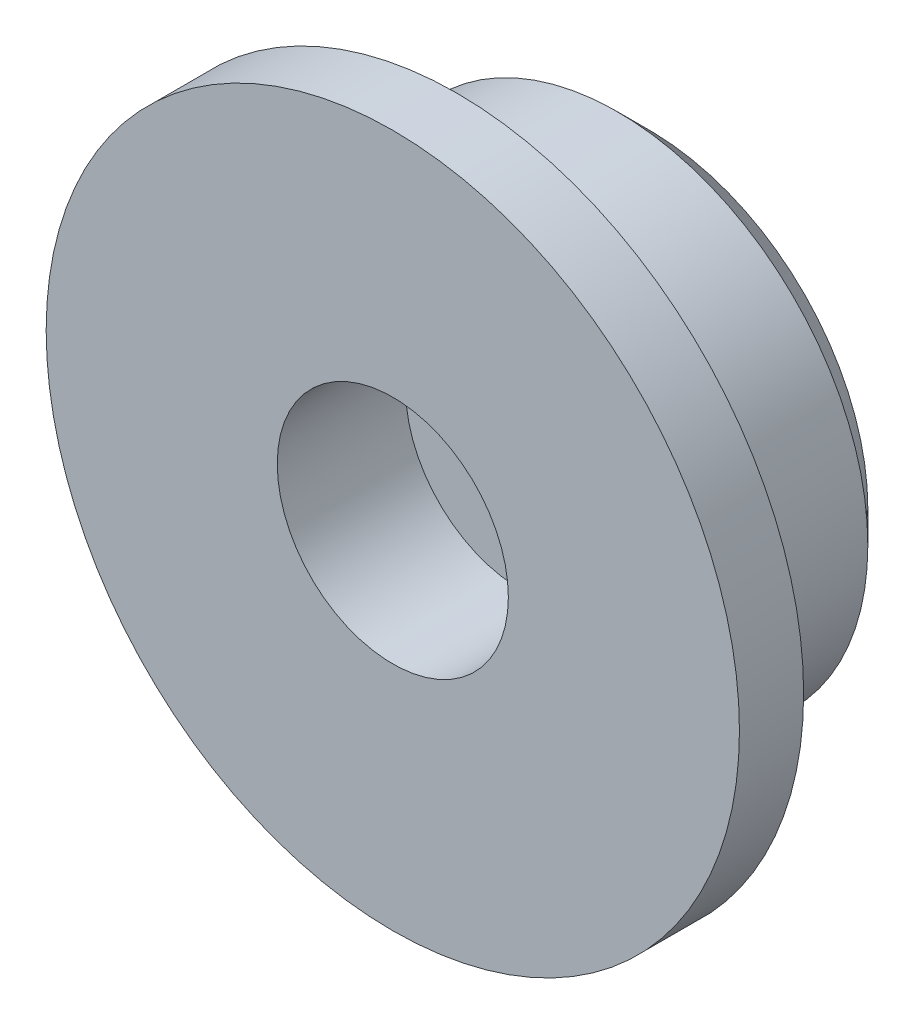
ISO-10303-21;
HEADER;
FILE_DESCRIPTION(('STEP AP214'),'2;1');
FILE_NAME('part.step','',(''),(''),'','','');
FILE_SCHEMA(('AUTOMOTIVE_DESIGN { 1 0 10303 214 1 1 1 1 }'));
ENDSEC;
DATA;
#1=APPLICATION_CONTEXT('core data for automotive mechanical design processes');
#2=APPLICATION_PROTOCOL_DEFINITION('international standard','automotive_design',2000,#1);
#3=PRODUCT_CONTEXT('',#1,'mechanical');
#4=PRODUCT('Part','Part','',(#3));
#5=PRODUCT_RELATED_PRODUCT_CATEGORY('part','',(#4));
#6=PRODUCT_DEFINITION_FORMATION('','',#4);
#7=PRODUCT_DEFINITION_CONTEXT('part definition',#1,'design');
#8=PRODUCT_DEFINITION('design','',#6,#7);
#9=PRODUCT_DEFINITION_SHAPE('','',#8);
#10=(LENGTH_UNIT() NAMED_UNIT(*) SI_UNIT(.MILLI.,.METRE.));
#11=(NAMED_UNIT(*) PLANE_ANGLE_UNIT() SI_UNIT($,.RADIAN.));
#12=(NAMED_UNIT(*) SI_UNIT($,.STERADIAN.) SOLID_ANGLE_UNIT());
#13=UNCERTAINTY_MEASURE_WITH_UNIT(LENGTH_MEASURE(1.E-05),#10,'distance_accuracy_value','');
#14=(GEOMETRIC_REPRESENTATION_CONTEXT(3) GLOBAL_UNCERTAINTY_ASSIGNED_CONTEXT((#13)) GLOBAL_UNIT_ASSIGNED_CONTEXT((#10,
#11,#12)) REPRESENTATION_CONTEXT('',''));
#15=CARTESIAN_POINT('',(0.,0.,0.));
#16=DIRECTION('',(0.,0.,1.));
#17=DIRECTION('',(1.,0.,0.));
#18=AXIS2_PLACEMENT_3D('',#15,#16,#17);
#19=CARTESIAN_POINT('',(0.,0.,3.));
#20=DIRECTION('',(0.,0.,-1.));
#21=DIRECTION('',(-1.,0.,0.));
#22=AXIS2_PLACEMENT_3D('',#19,#20,#21);
#23=CYLINDRICAL_SURFACE('',#22,3.9);
#24=CARTESIAN_POINT('',(0.,0.,0.499999999999999));
#25=DIRECTION('',(0.,0.,1.));
#26=DIRECTION('',(1.,0.,0.));
#27=AXIS2_PLACEMENT_3D('',#24,#25,#26);
#28=CIRCLE('',#27,3.9);
#29=CARTESIAN_POINT('',(3.9,0.,0.499999999999999));
#30=VERTEX_POINT('',#29);
#31=EDGE_CURVE('E42',#30,#30,#28,.T.);
#32=ORIENTED_EDGE('',*,*,#31,.T.);
#33=EDGE_LOOP('',(#32));
#34=FACE_BOUND('',#33,.T.);
#35=CARTESIAN_POINT('',(0.,0.,3.));
#36=DIRECTION('',(0.,0.,1.));
#37=DIRECTION('',(1.,0.,0.));
#38=AXIS2_PLACEMENT_3D('',#35,#36,#37);
#39=CIRCLE('',#38,3.9);
#40=CARTESIAN_POINT('',(3.9,0.,3.));
#41=VERTEX_POINT('',#40);
#42=EDGE_CURVE('E46',#41,#41,#39,.T.);
#43=ORIENTED_EDGE('',*,*,#42,.F.);
#44=EDGE_LOOP('',(#43));
#45=FACE_BOUND('',#44,.T.);
#46=ADVANCED_FACE('F35',(#34,#45),#23,.T.);
#47=CARTESIAN_POINT('',(0.,0.,0.));
#48=DIRECTION('',(0.,0.,1.));
#49=DIRECTION('',(1.,0.,0.));
#50=AXIS2_PLACEMENT_3D('',#47,#48,#49);
#51=PLANE('',#50);
#52=CARTESIAN_POINT('',(0.,0.,0.));
#53=DIRECTION('',(0.,0.,1.));
#54=DIRECTION('',(1.,0.,0.));
#55=AXIS2_PLACEMENT_3D('',#52,#53,#54);
#56=CIRCLE('',#55,3.4);
#57=CARTESIAN_POINT('',(3.4,0.,0.));
#58=VERTEX_POINT('',#57);
#59=EDGE_CURVE('E10',#58,#58,#56,.F.);
#60=ORIENTED_EDGE('',*,*,#59,.T.);
#61=EDGE_LOOP('',(#60));
#62=FACE_BOUND('',#61,.T.);
#63=ADVANCED_FACE('F92',(#62),#51,.F.);
#64=CARTESIAN_POINT('',(0.,0.,0.499999999999999));
#65=DIRECTION('',(0.,0.,1.));
#66=DIRECTION('',(1.,0.,0.));
#67=AXIS2_PLACEMENT_3D('',#64,#65,#66);
#68=CONICAL_SURFACE('',#67,3.9,0.78539816339745);
#69=ORIENTED_EDGE('',*,*,#59,.F.);
#70=EDGE_LOOP('',(#69));
#71=FACE_BOUND('',#70,.T.);
#72=ORIENTED_EDGE('',*,*,#31,.F.);
#73=EDGE_LOOP('',(#72));
#74=FACE_BOUND('',#73,.T.);
#75=ADVANCED_FACE('F37',(#71,#74),#68,.T.);
#76=CARTESIAN_POINT('',(0.,0.,3.));
#77=DIRECTION('',(0.,0.,1.));
#78=DIRECTION('',(1.,0.,0.));
#79=AXIS2_PLACEMENT_3D('',#76,#77,#78);
#80=PLANE('',#79);
#81=CARTESIAN_POINT('',(0.,0.,3.));
#82=DIRECTION('',(0.,0.,1.));
#83=DIRECTION('',(1.,0.,0.));
#84=AXIS2_PLACEMENT_3D('',#81,#82,#83);
#85=CIRCLE('',#84,5.4);
#86=CARTESIAN_POINT('',(5.4,0.,3.));
#87=VERTEX_POINT('',#86);
#88=EDGE_CURVE('E53',#87,#87,#85,.T.);
#89=ORIENTED_EDGE('',*,*,#88,.F.);
#90=EDGE_LOOP('',(#89));
#91=FACE_BOUND('',#90,.T.);
#92=ORIENTED_EDGE('',*,*,#42,.T.);
#93=EDGE_LOOP('',(#92));
#94=FACE_BOUND('',#93,.T.);
#95=ADVANCED_FACE('F82',(#91,#94),#80,.F.);
#96=CARTESIAN_POINT('',(0.,0.,4.));
#97=DIRECTION('',(0.,0.,-1.));
#98=DIRECTION('',(-1.,0.,0.));
#99=AXIS2_PLACEMENT_3D('',#96,#97,#98);
#100=CYLINDRICAL_SURFACE('',#99,5.4);
#101=CARTESIAN_POINT('',(0.,0.,4.));
#102=DIRECTION('',(0.,0.,1.));
#103=DIRECTION('',(1.,0.,0.));
#104=AXIS2_PLACEMENT_3D('',#101,#102,#103);
#105=CIRCLE('',#104,5.4);
#106=CARTESIAN_POINT('',(5.4,0.,4.));
#107=VERTEX_POINT('',#106);
#108=EDGE_CURVE('E50',#107,#107,#105,.T.);
#109=ORIENTED_EDGE('',*,*,#108,.F.);
#110=EDGE_LOOP('',(#109));
#111=FACE_BOUND('',#110,.T.);
#112=ORIENTED_EDGE('',*,*,#88,.T.);
#113=EDGE_LOOP('',(#112));
#114=FACE_BOUND('',#113,.T.);
#115=ADVANCED_FACE('F76',(#111,#114),#100,.T.);
#116=CARTESIAN_POINT('',(0.,0.,4.));
#117=DIRECTION('',(0.,0.,1.));
#118=DIRECTION('',(1.,0.,0.));
#119=AXIS2_PLACEMENT_3D('',#116,#117,#118);
#120=PLANE('',#119);
#121=CARTESIAN_POINT('',(0.,0.,4.));
#122=DIRECTION('',(0.,0.,1.));
#123=DIRECTION('',(1.,0.,0.));
#124=AXIS2_PLACEMENT_3D('',#121,#122,#123);
#125=CIRCLE('',#124,1.8);
#126=CARTESIAN_POINT('',(1.8,0.,4.));
#127=VERTEX_POINT('',#126);
#128=EDGE_CURVE('E59',#127,#127,#125,.T.);
#129=ORIENTED_EDGE('',*,*,#128,.F.);
#130=EDGE_LOOP('',(#129));
#131=FACE_BOUND('',#130,.T.);
#132=ORIENTED_EDGE('',*,*,#108,.T.);
#133=EDGE_LOOP('',(#132));
#134=FACE_BOUND('',#133,.T.);
#135=ADVANCED_FACE('F70',(#131,#134),#120,.T.);
#136=CARTESIAN_POINT('',(0.,0.,2.));
#137=DIRECTION('',(0.,0.,1.));
#138=DIRECTION('',(1.,0.,0.));
#139=AXIS2_PLACEMENT_3D('',#136,#137,#138);
#140=CYLINDRICAL_SURFACE('',#139,1.8);
#141=CARTESIAN_POINT('',(0.,0.,2.));
#142=DIRECTION('',(0.,0.,1.));
#143=DIRECTION('',(1.,0.,0.));
#144=AXIS2_PLACEMENT_3D('',#141,#142,#143);
#145=CIRCLE('',#144,1.8);
#146=CARTESIAN_POINT('',(1.8,0.,2.));
#147=VERTEX_POINT('',#146);
#148=EDGE_CURVE('E56',#147,#147,#145,.T.);
#149=ORIENTED_EDGE('',*,*,#148,.F.);
#150=EDGE_LOOP('',(#149));
#151=FACE_BOUND('',#150,.T.);
#152=ORIENTED_EDGE('',*,*,#128,.T.);
#153=EDGE_LOOP('',(#152));
#154=FACE_BOUND('',#153,.T.);
#155=ADVANCED_FACE('F67',(#151,#154),#140,.F.);
#156=CARTESIAN_POINT('',(0.,0.,2.));
#157=DIRECTION('',(0.,0.,1.));
#158=DIRECTION('',(1.,0.,0.));
#159=AXIS2_PLACEMENT_3D('',#156,#157,#158);
#160=PLANE('',#159);
#161=ORIENTED_EDGE('',*,*,#148,.T.);
#162=EDGE_LOOP('',(#161));
#163=FACE_BOUND('',#162,.T.);
#164=ADVANCED_FACE('F65',(#163),#160,.T.);
#165=CLOSED_SHELL('',(#46,#63,#75,#95,#115,#135,#155,#164));
#166=MANIFOLD_SOLID_BREP('B2',#165);
#167=ADVANCED_BREP_SHAPE_REPRESENTATION('',(#18,#166),#14);
#168=SHAPE_DEFINITION_REPRESENTATION(#9,#167);
ENDSEC;
END-ISO-10303-21;
